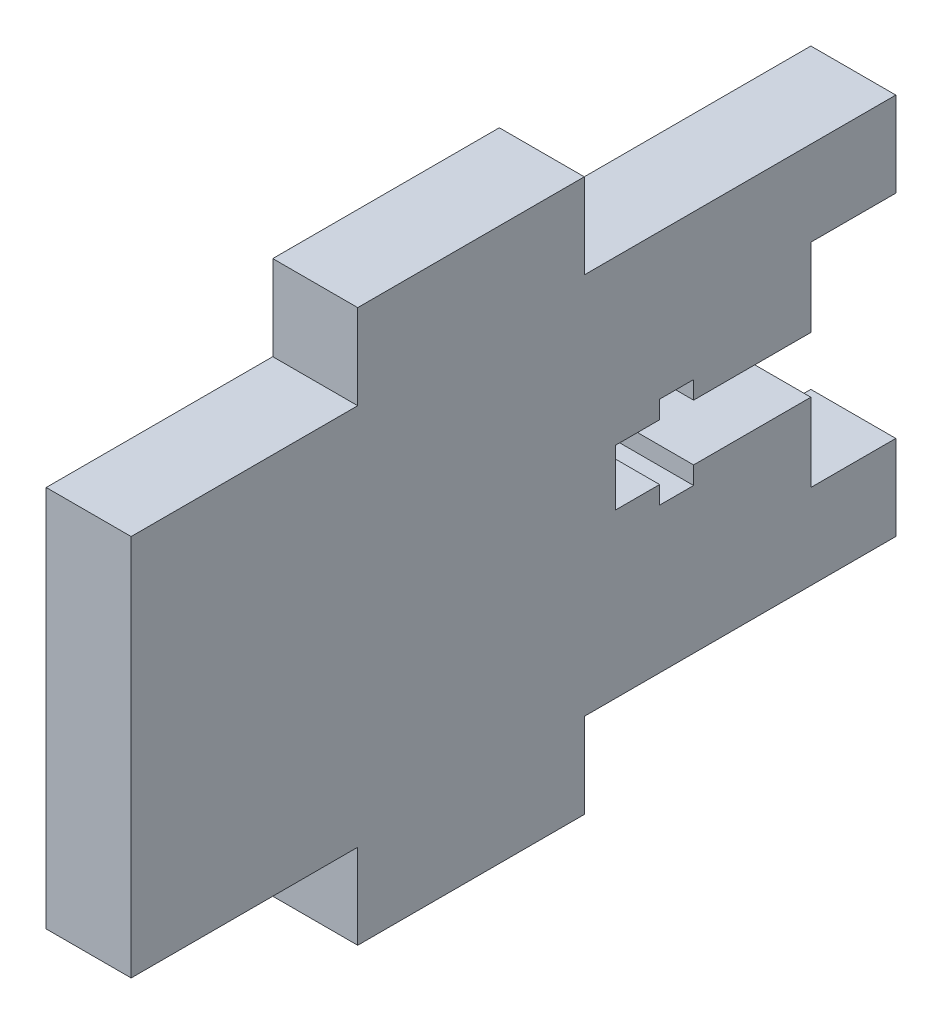
ISO-10303-21;
HEADER;
FILE_DESCRIPTION(('STEP AP214'),'2;1');
FILE_NAME('part.step','',(''),(''),'','','');
FILE_SCHEMA(('AUTOMOTIVE_DESIGN { 1 0 10303 214 1 1 1 1 }'));
ENDSEC;
DATA;
#1=APPLICATION_CONTEXT('core data for automotive mechanical design processes');
#2=APPLICATION_PROTOCOL_DEFINITION('international standard','automotive_design',2000,#1);
#3=PRODUCT_CONTEXT('',#1,'mechanical');
#4=PRODUCT('Part','Part','',(#3));
#5=PRODUCT_RELATED_PRODUCT_CATEGORY('part','',(#4));
#6=PRODUCT_DEFINITION_FORMATION('','',#4);
#7=PRODUCT_DEFINITION_CONTEXT('part definition',#1,'design');
#8=PRODUCT_DEFINITION('design','',#6,#7);
#9=PRODUCT_DEFINITION_SHAPE('','',#8);
#10=(LENGTH_UNIT() NAMED_UNIT(*) SI_UNIT(.MILLI.,.METRE.));
#11=(NAMED_UNIT(*) PLANE_ANGLE_UNIT() SI_UNIT($,.RADIAN.));
#12=(NAMED_UNIT(*) SI_UNIT($,.STERADIAN.) SOLID_ANGLE_UNIT());
#13=UNCERTAINTY_MEASURE_WITH_UNIT(LENGTH_MEASURE(1.E-05),#10,'distance_accuracy_value','');
#14=(GEOMETRIC_REPRESENTATION_CONTEXT(3) GLOBAL_UNCERTAINTY_ASSIGNED_CONTEXT((#13)) GLOBAL_UNIT_ASSIGNED_CONTEXT((#10,
#11,#12)) REPRESENTATION_CONTEXT('',''));
#15=CARTESIAN_POINT('',(0.,0.,0.));
#16=DIRECTION('',(0.,0.,1.));
#17=DIRECTION('',(1.,0.,0.));
#18=AXIS2_PLACEMENT_3D('',#15,#16,#17);
#19=CARTESIAN_POINT('',(0.,0.,0.));
#20=DIRECTION('',(0.,0.,-1.));
#21=DIRECTION('',(-1.,0.,0.));
#22=AXIS2_PLACEMENT_3D('',#19,#20,#21);
#23=PLANE('',#22);
#24=DIRECTION('',(-1.,0.,0.));
#25=VECTOR('',#24,1.);
#26=CARTESIAN_POINT('',(-22.22495,-2.09550000000003,0.));
#27=LINE('',#26,#25);
#28=CARTESIAN_POINT('',(-22.225,-2.09550000000003,0.));
#29=VERTEX_POINT('',#28);
#30=CARTESIAN_POINT('',(-28.575,-2.09550000000003,0.));
#31=VERTEX_POINT('',#30);
#32=EDGE_CURVE('E272',#29,#31,#27,.T.);
#33=ORIENTED_EDGE('',*,*,#32,.F.);
#34=DIRECTION('',(0.,1.,0.));
#35=VECTOR('',#34,1.);
#36=CARTESIAN_POINT('',(-22.225,14.2875,0.));
#37=LINE('',#36,#35);
#38=CARTESIAN_POINT('',(-22.225,-7.9375,0.));
#39=VERTEX_POINT('',#38);
#40=EDGE_CURVE('E372',#39,#29,#37,.T.);
#41=ORIENTED_EDGE('',*,*,#40,.F.);
#42=DIRECTION('',(1.,0.,0.));
#43=VECTOR('',#42,1.);
#44=CARTESIAN_POINT('',(-28.575,-7.9375,0.));
#45=LINE('',#44,#43);
#46=CARTESIAN_POINT('',(-28.575,-7.9375,0.));
#47=VERTEX_POINT('',#46);
#48=EDGE_CURVE('E322',#47,#39,#45,.T.);
#49=ORIENTED_EDGE('',*,*,#48,.F.);
#50=DIRECTION('',(0.,-1.,0.));
#51=VECTOR('',#50,1.);
#52=CARTESIAN_POINT('',(-28.575,14.2875,0.));
#53=LINE('',#52,#51);
#54=EDGE_CURVE('E375',#31,#47,#53,.T.);
#55=ORIENTED_EDGE('',*,*,#54,.F.);
#56=EDGE_LOOP('',(#33,#41,#49,#55));
#57=FACE_BOUND('',#56,.T.);
#58=ADVANCED_FACE('F35',(#57),#23,.T.);
#59=DIRECTION('',(-1.,0.,0.));
#60=VECTOR('',#59,1.);
#61=CARTESIAN_POINT('',(-22.22495,2.09549999999998,0.));
#62=LINE('',#61,#60);
#63=CARTESIAN_POINT('',(-22.225,2.09549999999998,0.));
#64=VERTEX_POINT('',#63);
#65=CARTESIAN_POINT('',(-28.575,2.09549999999997,0.));
#66=VERTEX_POINT('',#65);
#67=EDGE_CURVE('E275',#64,#66,#62,.T.);
#68=ORIENTED_EDGE('',*,*,#67,.T.);
#69=CARTESIAN_POINT('',(-28.575,7.9375,0.));
#70=VERTEX_POINT('',#69);
#71=EDGE_CURVE('E361',#70,#66,#53,.T.);
#72=ORIENTED_EDGE('',*,*,#71,.F.);
#73=DIRECTION('',(-1.,0.,0.));
#74=VECTOR('',#73,1.);
#75=CARTESIAN_POINT('',(-28.575,7.9375,0.));
#76=LINE('',#75,#74);
#77=CARTESIAN_POINT('',(-22.225,7.9375,0.));
#78=VERTEX_POINT('',#77);
#79=EDGE_CURVE('E341',#78,#70,#76,.T.);
#80=ORIENTED_EDGE('',*,*,#79,.F.);
#81=EDGE_CURVE('E39',#64,#78,#37,.T.);
#82=ORIENTED_EDGE('',*,*,#81,.F.);
#83=EDGE_LOOP('',(#68,#72,#80,#82));
#84=FACE_BOUND('',#83,.T.);
#85=ADVANCED_FACE('F525',(#84),#23,.T.);
#86=CARTESIAN_POINT('',(-22.225,14.2875,80.0720536519049));
#87=DIRECTION('',(0.,-1.,0.));
#88=DIRECTION('',(0.,0.,-1.));
#89=AXIS2_PLACEMENT_3D('',#86,#87,#88);
#90=PLANE('',#89);
#91=DIRECTION('',(1.,0.,0.));
#92=VECTOR('',#91,1.);
#93=CARTESIAN_POINT('',(-22.225,14.2875,33.8666666666667));
#94=LINE('',#93,#92);
#95=CARTESIAN_POINT('',(-28.575,14.2875,33.8666666666667));
#96=VERTEX_POINT('',#95);
#97=CARTESIAN_POINT('',(-22.225,14.2875,33.8666666666667));
#98=VERTEX_POINT('',#97);
#99=EDGE_CURVE('E437',#96,#98,#94,.T.);
#100=ORIENTED_EDGE('',*,*,#99,.F.);
#101=DIRECTION('',(0.,0.,-1.));
#102=VECTOR('',#101,1.);
#103=CARTESIAN_POINT('',(-28.575,14.2875,80.0720536519049));
#104=LINE('',#103,#102);
#105=CARTESIAN_POINT('',(-28.575,14.2875,50.8));
#106=VERTEX_POINT('',#105);
#107=EDGE_CURVE('E398',#106,#96,#104,.T.);
#108=ORIENTED_EDGE('',*,*,#107,.F.);
#109=DIRECTION('',(-1.,0.,0.));
#110=VECTOR('',#109,1.);
#111=CARTESIAN_POINT('',(-22.225,14.2875,50.8));
#112=LINE('',#111,#110);
#113=CARTESIAN_POINT('',(-22.225,14.2875,50.8));
#114=VERTEX_POINT('',#113);
#115=EDGE_CURVE('E384',#114,#106,#112,.T.);
#116=ORIENTED_EDGE('',*,*,#115,.F.);
#117=DIRECTION('',(0.,0.,-1.));
#118=VECTOR('',#117,1.);
#119=CARTESIAN_POINT('',(-22.225,14.2875,80.0720536519049));
#120=LINE('',#119,#118);
#121=EDGE_CURVE('E394',#114,#98,#120,.T.);
#122=ORIENTED_EDGE('',*,*,#121,.T.);
#123=EDGE_LOOP('',(#100,#108,#116,#122));
#124=FACE_BOUND('',#123,.T.);
#125=ADVANCED_FACE('F454',(#124),#90,.F.);
#126=DIRECTION('',(-1.,0.,0.));
#127=VECTOR('',#126,1.);
#128=CARTESIAN_POINT('',(-22.225,14.2875,16.9333333333333));
#129=LINE('',#128,#127);
#130=CARTESIAN_POINT('',(-22.225,14.2875,16.9333333333333));
#131=VERTEX_POINT('',#130);
#132=CARTESIAN_POINT('',(-28.575,14.2875,16.9333333333333));
#133=VERTEX_POINT('',#132);
#134=EDGE_CURVE('E435',#131,#133,#129,.T.);
#135=ORIENTED_EDGE('',*,*,#134,.F.);
#136=CARTESIAN_POINT('',(-22.225,14.2875,-6.35));
#137=VERTEX_POINT('',#136);
#138=EDGE_CURVE('E374',#131,#137,#120,.T.);
#139=ORIENTED_EDGE('',*,*,#138,.T.);
#140=DIRECTION('',(1.,0.,0.));
#141=VECTOR('',#140,1.);
#142=CARTESIAN_POINT('',(-28.575,14.2875,-6.35));
#143=LINE('',#142,#141);
#144=CARTESIAN_POINT('',(-28.575,14.2875,-6.35));
#145=VERTEX_POINT('',#144);
#146=EDGE_CURVE('E345',#145,#137,#143,.T.);
#147=ORIENTED_EDGE('',*,*,#146,.F.);
#148=EDGE_CURVE('E397',#133,#145,#104,.T.);
#149=ORIENTED_EDGE('',*,*,#148,.F.);
#150=EDGE_LOOP('',(#135,#139,#147,#149));
#151=FACE_BOUND('',#150,.T.);
#152=ADVANCED_FACE('F488',(#151),#90,.F.);
#153=CARTESIAN_POINT('',(-22.225,-14.2875,80.0720536519049));
#154=DIRECTION('',(0.,1.,0.));
#155=DIRECTION('',(-1.,0.,0.));
#156=AXIS2_PLACEMENT_3D('',#153,#154,#155);
#157=PLANE('',#156);
#158=DIRECTION('',(-1.,0.,0.));
#159=VECTOR('',#158,1.);
#160=CARTESIAN_POINT('',(-22.225,-14.2875,33.8666666666667));
#161=LINE('',#160,#159);
#162=CARTESIAN_POINT('',(-22.225,-14.2875,33.8666666666667));
#163=VERTEX_POINT('',#162);
#164=CARTESIAN_POINT('',(-28.575,-14.2875,33.8666666666667));
#165=VERTEX_POINT('',#164);
#166=EDGE_CURVE('E12',#163,#165,#161,.T.);
#167=ORIENTED_EDGE('',*,*,#166,.F.);
#168=DIRECTION('',(0.,0.,-1.));
#169=VECTOR('',#168,1.);
#170=CARTESIAN_POINT('',(-22.225,-14.2875,80.0720536519049));
#171=LINE('',#170,#169);
#172=CARTESIAN_POINT('',(-22.225,-14.2875,50.8));
#173=VERTEX_POINT('',#172);
#174=EDGE_CURVE('E403',#173,#163,#171,.T.);
#175=ORIENTED_EDGE('',*,*,#174,.F.);
#176=DIRECTION('',(1.,0.,0.));
#177=VECTOR('',#176,1.);
#178=CARTESIAN_POINT('',(-22.225,-14.2875,50.8));
#179=LINE('',#178,#177);
#180=CARTESIAN_POINT('',(-28.575,-14.2875,50.8));
#181=VERTEX_POINT('',#180);
#182=EDGE_CURVE('E390',#181,#173,#179,.T.);
#183=ORIENTED_EDGE('',*,*,#182,.F.);
#184=DIRECTION('',(0.,0.,-1.));
#185=VECTOR('',#184,1.);
#186=CARTESIAN_POINT('',(-28.575,-14.2875,80.0720536519049));
#187=LINE('',#186,#185);
#188=EDGE_CURVE('E393',#181,#165,#187,.T.);
#189=ORIENTED_EDGE('',*,*,#188,.T.);
#190=EDGE_LOOP('',(#167,#175,#183,#189));
#191=FACE_BOUND('',#190,.T.);
#192=ADVANCED_FACE('F516',(#191),#157,.F.);
#193=DIRECTION('',(1.,0.,0.));
#194=VECTOR('',#193,1.);
#195=CARTESIAN_POINT('',(-22.225,-14.2875,16.9333333333333));
#196=LINE('',#195,#194);
#197=CARTESIAN_POINT('',(-28.575,-14.2875,16.9333333333333));
#198=VERTEX_POINT('',#197);
#199=CARTESIAN_POINT('',(-22.225,-14.2875,16.9333333333333));
#200=VERTEX_POINT('',#199);
#201=EDGE_CURVE('E45',#198,#200,#196,.T.);
#202=ORIENTED_EDGE('',*,*,#201,.F.);
#203=CARTESIAN_POINT('',(-28.575,-14.2875,-6.35));
#204=VERTEX_POINT('',#203);
#205=EDGE_CURVE('E402',#198,#204,#187,.T.);
#206=ORIENTED_EDGE('',*,*,#205,.T.);
#207=DIRECTION('',(-1.,0.,0.));
#208=VECTOR('',#207,1.);
#209=CARTESIAN_POINT('',(-28.575,-14.2875,-6.35));
#210=LINE('',#209,#208);
#211=CARTESIAN_POINT('',(-22.225,-14.2875,-6.35));
#212=VERTEX_POINT('',#211);
#213=EDGE_CURVE('E331',#212,#204,#210,.T.);
#214=ORIENTED_EDGE('',*,*,#213,.F.);
#215=EDGE_CURVE('E406',#200,#212,#171,.T.);
#216=ORIENTED_EDGE('',*,*,#215,.F.);
#217=EDGE_LOOP('',(#202,#206,#214,#216));
#218=FACE_BOUND('',#217,.T.);
#219=ADVANCED_FACE('F514',(#218),#157,.F.);
#220=CARTESIAN_POINT('',(-22.225,14.2875,80.0720536519049));
#221=DIRECTION('',(-1.,0.,0.));
#222=DIRECTION('',(0.,-1.,0.));
#223=AXIS2_PLACEMENT_3D('',#220,#221,#222);
#224=PLANE('',#223);
#225=ORIENTED_EDGE('',*,*,#40,.T.);
#226=DIRECTION('',(0.,0.,1.));
#227=VECTOR('',#226,1.);
#228=CARTESIAN_POINT('',(-22.225,-2.09549999999973,80.072053651905));
#229=LINE('',#228,#227);
#230=CARTESIAN_POINT('',(-22.225,-2.09549999999999,8.76299999999999));
#231=VERTEX_POINT('',#230);
#232=EDGE_CURVE('E319',#29,#231,#229,.T.);
#233=ORIENTED_EDGE('',*,*,#232,.T.);
#234=DIRECTION('',(0.,-1.,0.));
#235=VECTOR('',#234,1.);
#236=CARTESIAN_POINT('',(-22.225,14.2874999999985,8.76299999999965));
#237=LINE('',#236,#235);
#238=CARTESIAN_POINT('',(-22.225,-3.42899999999999,8.76300000000002));
#239=VERTEX_POINT('',#238);
#240=EDGE_CURVE('E274',#231,#239,#237,.T.);
#241=ORIENTED_EDGE('',*,*,#240,.T.);
#242=DIRECTION('',(0.,0.,1.));
#243=VECTOR('',#242,1.);
#244=CARTESIAN_POINT('',(-22.225,-3.42899999999975,80.072053651905));
#245=LINE('',#244,#243);
#246=CARTESIAN_POINT('',(-22.225,-3.42899999999999,11.303));
#247=VERTEX_POINT('',#246);
#248=EDGE_CURVE('E233',#239,#247,#245,.T.);
#249=ORIENTED_EDGE('',*,*,#248,.T.);
#250=DIRECTION('',(0.,1.,0.));
#251=VECTOR('',#250,1.);
#252=CARTESIAN_POINT('',(-22.225,14.2874999999986,11.3029999999996));
#253=LINE('',#252,#251);
#254=CARTESIAN_POINT('',(-22.225,-2.09549999999998,11.303));
#255=VERTEX_POINT('',#254);
#256=EDGE_CURVE('E296',#247,#255,#253,.T.);
#257=ORIENTED_EDGE('',*,*,#256,.T.);
#258=DIRECTION('',(0.,0.,1.));
#259=VECTOR('',#258,1.);
#260=CARTESIAN_POINT('',(-22.225,-2.09549999999974,80.072053651905));
#261=LINE('',#260,#259);
#262=CARTESIAN_POINT('',(-22.225,-2.09549999999997,14.605));
#263=VERTEX_POINT('',#262);
#264=EDGE_CURVE('E299',#255,#263,#261,.T.);
#265=ORIENTED_EDGE('',*,*,#264,.T.);
#266=DIRECTION('',(0.,1.,0.));
#267=VECTOR('',#266,1.);
#268=CARTESIAN_POINT('',(-22.225,14.2875,14.605));
#269=LINE('',#268,#267);
#270=CARTESIAN_POINT('',(-22.225,2.09550000000003,14.605));
#271=VERTEX_POINT('',#270);
#272=EDGE_CURVE('E302',#263,#271,#269,.T.);
#273=ORIENTED_EDGE('',*,*,#272,.T.);
#274=DIRECTION('',(0.,0.,-1.));
#275=VECTOR('',#274,1.);
#276=CARTESIAN_POINT('',(-22.225,2.09550000000027,80.072053651905));
#277=LINE('',#276,#275);
#278=CARTESIAN_POINT('',(-22.225,2.09550000000002,11.303));
#279=VERTEX_POINT('',#278);
#280=EDGE_CURVE('E305',#271,#279,#277,.T.);
#281=ORIENTED_EDGE('',*,*,#280,.T.);
#282=DIRECTION('',(0.,1.,0.));
#283=VECTOR('',#282,1.);
#284=CARTESIAN_POINT('',(-22.225,14.2875,11.303));
#285=LINE('',#284,#283);
#286=CARTESIAN_POINT('',(-22.225,3.42900000000002,11.303));
#287=VERTEX_POINT('',#286);
#288=EDGE_CURVE('E308',#279,#287,#285,.T.);
#289=ORIENTED_EDGE('',*,*,#288,.T.);
#290=DIRECTION('',(0.,0.,-1.));
#291=VECTOR('',#290,1.);
#292=CARTESIAN_POINT('',(-22.225,3.42900000000026,80.072053651905));
#293=LINE('',#292,#291);
#294=CARTESIAN_POINT('',(-22.225,3.42900000000001,8.76299999999999));
#295=VERTEX_POINT('',#294);
#296=EDGE_CURVE('E311',#287,#295,#293,.T.);
#297=ORIENTED_EDGE('',*,*,#296,.T.);
#298=DIRECTION('',(0.,-1.,0.));
#299=VECTOR('',#298,1.);
#300=CARTESIAN_POINT('',(-22.225,14.2875,8.76299999999999));
#301=LINE('',#300,#299);
#302=CARTESIAN_POINT('',(-22.225,2.09550000000001,8.76299999999999));
#303=VERTEX_POINT('',#302);
#304=EDGE_CURVE('E314',#295,#303,#301,.T.);
#305=ORIENTED_EDGE('',*,*,#304,.T.);
#306=DIRECTION('',(0.,0.,-1.));
#307=VECTOR('',#306,1.);
#308=CARTESIAN_POINT('',(-22.225,2.09550000000026,80.072053651905));
#309=LINE('',#308,#307);
#310=EDGE_CURVE('E317',#303,#64,#309,.T.);
#311=ORIENTED_EDGE('',*,*,#310,.T.);
#312=ORIENTED_EDGE('',*,*,#81,.T.);
#313=DIRECTION('',(0.,0.,1.));
#314=VECTOR('',#313,1.);
#315=CARTESIAN_POINT('',(-22.225,7.9375,-6.35));
#316=LINE('',#315,#314);
#317=CARTESIAN_POINT('',(-22.225,7.9375,-6.35));
#318=VERTEX_POINT('',#317);
#319=EDGE_CURVE('E365',#318,#78,#316,.T.);
#320=ORIENTED_EDGE('',*,*,#319,.F.);
#321=DIRECTION('',(0.,-1.,0.));
#322=VECTOR('',#321,1.);
#323=CARTESIAN_POINT('',(-22.225,14.2875,-6.35));
#324=LINE('',#323,#322);
#325=EDGE_CURVE('E348',#137,#318,#324,.T.);
#326=ORIENTED_EDGE('',*,*,#325,.F.);
#327=ORIENTED_EDGE('',*,*,#138,.F.);
#328=DIRECTION('',(0.,1.,0.));
#329=VECTOR('',#328,1.);
#330=CARTESIAN_POINT('',(-22.225,-38.7223079275888,16.9333333333333));
#331=LINE('',#330,#329);
#332=CARTESIAN_POINT('',(-22.225,20.6375,16.9333333333333));
#333=VERTEX_POINT('',#332);
#334=EDGE_CURVE('E425',#131,#333,#331,.T.);
#335=ORIENTED_EDGE('',*,*,#334,.T.);
#336=DIRECTION('',(0.,0.,-1.));
#337=VECTOR('',#336,1.);
#338=CARTESIAN_POINT('',(-22.225,20.6375,33.8666666666667));
#339=LINE('',#338,#337);
#340=CARTESIAN_POINT('',(-22.225,20.6375,33.8666666666667));
#341=VERTEX_POINT('',#340);
#342=EDGE_CURVE('E355',#341,#333,#339,.T.);
#343=ORIENTED_EDGE('',*,*,#342,.F.);
#344=DIRECTION('',(0.,1.,0.));
#345=VECTOR('',#344,1.);
#346=CARTESIAN_POINT('',(-22.225,-38.7223079275888,33.8666666666667));
#347=LINE('',#346,#345);
#348=EDGE_CURVE('E444',#98,#341,#347,.T.);
#349=ORIENTED_EDGE('',*,*,#348,.F.);
#350=ORIENTED_EDGE('',*,*,#121,.F.);
#351=DIRECTION('',(0.,1.,0.));
#352=VECTOR('',#351,1.);
#353=CARTESIAN_POINT('',(-22.225,14.2875,50.8));
#354=LINE('',#353,#352);
#355=EDGE_CURVE('E387',#173,#114,#354,.T.);
#356=ORIENTED_EDGE('',*,*,#355,.F.);
#357=ORIENTED_EDGE('',*,*,#174,.T.);
#358=CARTESIAN_POINT('',(-22.225,-20.6375,33.8666666666667));
#359=VERTEX_POINT('',#358);
#360=EDGE_CURVE('E428',#359,#163,#347,.T.);
#361=ORIENTED_EDGE('',*,*,#360,.F.);
#362=DIRECTION('',(0.,0.,-1.));
#363=VECTOR('',#362,1.);
#364=CARTESIAN_POINT('',(-22.225,-20.6375,33.8666666666667));
#365=LINE('',#364,#363);
#366=CARTESIAN_POINT('',(-22.225,-20.6375,16.9333333333333));
#367=VERTEX_POINT('',#366);
#368=EDGE_CURVE('E423',#359,#367,#365,.T.);
#369=ORIENTED_EDGE('',*,*,#368,.T.);
#370=EDGE_CURVE('E415',#367,#200,#331,.T.);
#371=ORIENTED_EDGE('',*,*,#370,.T.);
#372=ORIENTED_EDGE('',*,*,#215,.T.);
#373=DIRECTION('',(0.,-1.,0.));
#374=VECTOR('',#373,1.);
#375=CARTESIAN_POINT('',(-22.225,-14.2875,-6.35));
#376=LINE('',#375,#374);
#377=CARTESIAN_POINT('',(-22.225,-7.9375,-6.35));
#378=VERTEX_POINT('',#377);
#379=EDGE_CURVE('E328',#378,#212,#376,.T.);
#380=ORIENTED_EDGE('',*,*,#379,.F.);
#381=DIRECTION('',(0.,0.,1.));
#382=VECTOR('',#381,1.);
#383=CARTESIAN_POINT('',(-22.225,-7.9375,-6.35));
#384=LINE('',#383,#382);
#385=EDGE_CURVE('E334',#378,#39,#384,.T.);
#386=ORIENTED_EDGE('',*,*,#385,.T.);
#387=EDGE_LOOP('',(#225,#233,#241,#249,#257,#265,#273,#281,#289,#297,#305,#311,#312,#320,#326,
#327,#335,#343,#349,#350,#356,#357,#361,#369,#371,#372,#380,#386));
#388=FACE_BOUND('',#387,.T.);
#389=ADVANCED_FACE('F420',(#388),#224,.F.);
#390=CARTESIAN_POINT('',(-28.575,14.2875,80.0720536519049));
#391=DIRECTION('',(1.,0.,0.));
#392=DIRECTION('',(0.,1.,0.));
#393=AXIS2_PLACEMENT_3D('',#390,#391,#392);
#394=PLANE('',#393);
#395=DIRECTION('',(0.,-1.,0.));
#396=VECTOR('',#395,1.);
#397=CARTESIAN_POINT('',(-28.575,-3.429,8.76300000000002));
#398=LINE('',#397,#396);
#399=CARTESIAN_POINT('',(-28.575,-2.0955,8.76299999999999));
#400=VERTEX_POINT('',#399);
#401=CARTESIAN_POINT('',(-28.575,-3.429,8.76300000000002));
#402=VERTEX_POINT('',#401);
#403=EDGE_CURVE('E240',#400,#402,#398,.T.);
#404=ORIENTED_EDGE('',*,*,#403,.F.);
#405=DIRECTION('',(0.,0.,1.));
#406=VECTOR('',#405,1.);
#407=CARTESIAN_POINT('',(-28.575,-2.0955,8.76299999999999));
#408=LINE('',#407,#406);
#409=EDGE_CURVE('E53',#31,#400,#408,.T.);
#410=ORIENTED_EDGE('',*,*,#409,.F.);
#411=ORIENTED_EDGE('',*,*,#54,.T.);
#412=DIRECTION('',(0.,0.,1.));
#413=VECTOR('',#412,1.);
#414=CARTESIAN_POINT('',(-28.575,-7.9375,-6.35));
#415=LINE('',#414,#413);
#416=CARTESIAN_POINT('',(-28.575,-7.9375,-6.35));
#417=VERTEX_POINT('',#416);
#418=EDGE_CURVE('E338',#417,#47,#415,.T.);
#419=ORIENTED_EDGE('',*,*,#418,.F.);
#420=DIRECTION('',(0.,1.,0.));
#421=VECTOR('',#420,1.);
#422=CARTESIAN_POINT('',(-28.575,-14.2875,-6.35));
#423=LINE('',#422,#421);
#424=EDGE_CURVE('E323',#204,#417,#423,.T.);
#425=ORIENTED_EDGE('',*,*,#424,.F.);
#426=ORIENTED_EDGE('',*,*,#205,.F.);
#427=DIRECTION('',(0.,1.,0.));
#428=VECTOR('',#427,1.);
#429=CARTESIAN_POINT('',(-28.575,-38.7223079275888,16.9333333333333));
#430=LINE('',#429,#428);
#431=CARTESIAN_POINT('',(-28.575,-20.6375,16.9333333333333));
#432=VERTEX_POINT('',#431);
#433=EDGE_CURVE('E418',#432,#198,#430,.T.);
#434=ORIENTED_EDGE('',*,*,#433,.F.);
#435=DIRECTION('',(0.,0.,1.));
#436=VECTOR('',#435,1.);
#437=CARTESIAN_POINT('',(-28.575,-20.6375,33.8666666666667));
#438=LINE('',#437,#436);
#439=CARTESIAN_POINT('',(-28.575,-20.6375,33.8666666666667));
#440=VERTEX_POINT('',#439);
#441=EDGE_CURVE('E438',#432,#440,#438,.T.);
#442=ORIENTED_EDGE('',*,*,#441,.T.);
#443=DIRECTION('',(0.,1.,0.));
#444=VECTOR('',#443,1.);
#445=CARTESIAN_POINT('',(-28.575,-38.7223079275888,33.8666666666667));
#446=LINE('',#445,#444);
#447=EDGE_CURVE('E453',#440,#165,#446,.T.);
#448=ORIENTED_EDGE('',*,*,#447,.T.);
#449=ORIENTED_EDGE('',*,*,#188,.F.);
#450=DIRECTION('',(0.,-1.,0.));
#451=VECTOR('',#450,1.);
#452=CARTESIAN_POINT('',(-28.575,14.2875,50.8));
#453=LINE('',#452,#451);
#454=EDGE_CURVE('E380',#106,#181,#453,.T.);
#455=ORIENTED_EDGE('',*,*,#454,.F.);
#456=ORIENTED_EDGE('',*,*,#107,.T.);
#457=CARTESIAN_POINT('',(-28.575,20.6375,33.8666666666667));
#458=VERTEX_POINT('',#457);
#459=EDGE_CURVE('E446',#96,#458,#446,.T.);
#460=ORIENTED_EDGE('',*,*,#459,.T.);
#461=DIRECTION('',(0.,0.,1.));
#462=VECTOR('',#461,1.);
#463=CARTESIAN_POINT('',(-28.575,20.6375,33.8666666666667));
#464=LINE('',#463,#462);
#465=CARTESIAN_POINT('',(-28.575,20.6375,16.9333333333333));
#466=VERTEX_POINT('',#465);
#467=EDGE_CURVE('E474',#466,#458,#464,.T.);
#468=ORIENTED_EDGE('',*,*,#467,.F.);
#469=EDGE_CURVE('E424',#133,#466,#430,.T.);
#470=ORIENTED_EDGE('',*,*,#469,.F.);
#471=ORIENTED_EDGE('',*,*,#148,.T.);
#472=DIRECTION('',(0.,1.,0.));
#473=VECTOR('',#472,1.);
#474=CARTESIAN_POINT('',(-28.575,14.2875,-6.35));
#475=LINE('',#474,#473);
#476=CARTESIAN_POINT('',(-28.575,7.9375,-6.35));
#477=VERTEX_POINT('',#476);
#478=EDGE_CURVE('E342',#477,#145,#475,.T.);
#479=ORIENTED_EDGE('',*,*,#478,.F.);
#480=DIRECTION('',(0.,0.,1.));
#481=VECTOR('',#480,1.);
#482=CARTESIAN_POINT('',(-28.575,7.9375,-6.35));
#483=LINE('',#482,#481);
#484=EDGE_CURVE('E352',#477,#70,#483,.T.);
#485=ORIENTED_EDGE('',*,*,#484,.T.);
#486=ORIENTED_EDGE('',*,*,#71,.T.);
#487=DIRECTION('',(0.,0.,-1.));
#488=VECTOR('',#487,1.);
#489=CARTESIAN_POINT('',(-28.575,2.0955,8.76299999999999));
#490=LINE('',#489,#488);
#491=CARTESIAN_POINT('',(-28.575,2.0955,8.76299999999999));
#492=VERTEX_POINT('',#491);
#493=EDGE_CURVE('E270',#492,#66,#490,.T.);
#494=ORIENTED_EDGE('',*,*,#493,.F.);
#495=DIRECTION('',(0.,-1.,0.));
#496=VECTOR('',#495,1.);
#497=CARTESIAN_POINT('',(-28.575,3.429,8.76299999999999));
#498=LINE('',#497,#496);
#499=CARTESIAN_POINT('',(-28.575,3.429,8.76299999999999));
#500=VERTEX_POINT('',#499);
#501=EDGE_CURVE('E267',#500,#492,#498,.T.);
#502=ORIENTED_EDGE('',*,*,#501,.F.);
#503=DIRECTION('',(0.,0.,-1.));
#504=VECTOR('',#503,1.);
#505=CARTESIAN_POINT('',(-28.575,3.42900000000001,11.303));
#506=LINE('',#505,#504);
#507=CARTESIAN_POINT('',(-28.575,3.42900000000001,11.303));
#508=VERTEX_POINT('',#507);
#509=EDGE_CURVE('E264',#508,#500,#506,.T.);
#510=ORIENTED_EDGE('',*,*,#509,.F.);
#511=DIRECTION('',(0.,1.,0.));
#512=VECTOR('',#511,1.);
#513=CARTESIAN_POINT('',(-28.575,2.09550000000001,11.303));
#514=LINE('',#513,#512);
#515=CARTESIAN_POINT('',(-28.575,2.09550000000001,11.303));
#516=VERTEX_POINT('',#515);
#517=EDGE_CURVE('E261',#516,#508,#514,.T.);
#518=ORIENTED_EDGE('',*,*,#517,.F.);
#519=DIRECTION('',(0.,0.,-1.));
#520=VECTOR('',#519,1.);
#521=CARTESIAN_POINT('',(-28.575,2.09550000000001,11.303));
#522=LINE('',#521,#520);
#523=CARTESIAN_POINT('',(-28.575,2.09550000000003,14.605));
#524=VERTEX_POINT('',#523);
#525=EDGE_CURVE('E258',#524,#516,#522,.T.);
#526=ORIENTED_EDGE('',*,*,#525,.F.);
#527=DIRECTION('',(0.,1.,0.));
#528=VECTOR('',#527,1.);
#529=CARTESIAN_POINT('',(-28.575,-2.09549999999998,14.605));
#530=LINE('',#529,#528);
#531=CARTESIAN_POINT('',(-28.575,-2.09549999999998,14.605));
#532=VERTEX_POINT('',#531);
#533=EDGE_CURVE('E255',#532,#524,#530,.T.);
#534=ORIENTED_EDGE('',*,*,#533,.F.);
#535=DIRECTION('',(0.,0.,1.));
#536=VECTOR('',#535,1.);
#537=CARTESIAN_POINT('',(-28.575,-2.09549999999999,11.303));
#538=LINE('',#537,#536);
#539=CARTESIAN_POINT('',(-28.575,-2.09549999999999,11.303));
#540=VERTEX_POINT('',#539);
#541=EDGE_CURVE('E249',#540,#532,#538,.T.);
#542=ORIENTED_EDGE('',*,*,#541,.F.);
#543=DIRECTION('',(0.,1.,0.));
#544=VECTOR('',#543,1.);
#545=CARTESIAN_POINT('',(-28.575,-2.09549999999999,11.303));
#546=LINE('',#545,#544);
#547=CARTESIAN_POINT('',(-28.575,-3.42899999999999,11.303));
#548=VERTEX_POINT('',#547);
#549=EDGE_CURVE('E247',#548,#540,#546,.T.);
#550=ORIENTED_EDGE('',*,*,#549,.F.);
#551=DIRECTION('',(0.,0.,1.));
#552=VECTOR('',#551,1.);
#553=CARTESIAN_POINT('',(-28.575,-3.42899999999999,11.303));
#554=LINE('',#553,#552);
#555=EDGE_CURVE('E230',#402,#548,#554,.T.);
#556=ORIENTED_EDGE('',*,*,#555,.F.);
#557=EDGE_LOOP('',(#404,#410,#411,#419,#425,#426,#434,#442,#448,#449,#455,#456,#460,#468,#470,
#471,#479,#485,#486,#494,#502,#510,#518,#526,#534,#542,#550,#556));
#558=FACE_BOUND('',#557,.T.);
#559=ADVANCED_FACE('F244',(#558),#394,.F.);
#560=CARTESIAN_POINT('',(0.,0.,50.8));
#561=DIRECTION('',(0.,0.,1.));
#562=DIRECTION('',(1.,0.,0.));
#563=AXIS2_PLACEMENT_3D('',#560,#561,#562);
#564=PLANE('',#563);
#565=ORIENTED_EDGE('',*,*,#182,.T.);
#566=ORIENTED_EDGE('',*,*,#355,.T.);
#567=ORIENTED_EDGE('',*,*,#115,.T.);
#568=ORIENTED_EDGE('',*,*,#454,.T.);
#569=EDGE_LOOP('',(#565,#566,#567,#568));
#570=FACE_BOUND('',#569,.T.);
#571=ADVANCED_FACE('F37',(#570),#564,.T.);
#572=CARTESIAN_POINT('',(-22.225,-20.6375,50.8));
#573=DIRECTION('',(0.,1.,0.));
#574=DIRECTION('',(0.,0.,1.));
#575=AXIS2_PLACEMENT_3D('',#572,#573,#574);
#576=PLANE('',#575);
#577=DIRECTION('',(-1.,0.,0.));
#578=VECTOR('',#577,1.);
#579=CARTESIAN_POINT('',(-28.575,-20.6375,16.9333333333333));
#580=LINE('',#579,#578);
#581=EDGE_CURVE('E466',#367,#432,#580,.T.);
#582=ORIENTED_EDGE('',*,*,#581,.F.);
#583=ORIENTED_EDGE('',*,*,#368,.F.);
#584=DIRECTION('',(1.,0.,0.));
#585=VECTOR('',#584,1.);
#586=CARTESIAN_POINT('',(-28.575,-20.6375,33.8666666666667));
#587=LINE('',#586,#585);
#588=EDGE_CURVE('E432',#440,#359,#587,.T.);
#589=ORIENTED_EDGE('',*,*,#588,.F.);
#590=ORIENTED_EDGE('',*,*,#441,.F.);
#591=EDGE_LOOP('',(#582,#583,#589,#590));
#592=FACE_BOUND('',#591,.T.);
#593=ADVANCED_FACE('F465',(#592),#576,.F.);
#594=CARTESIAN_POINT('',(-28.575,-38.7223079275888,16.9333333333333));
#595=DIRECTION('',(0.,0.,1.));
#596=DIRECTION('',(1.,0.,0.));
#597=AXIS2_PLACEMENT_3D('',#594,#595,#596);
#598=PLANE('',#597);
#599=ORIENTED_EDGE('',*,*,#433,.T.);
#600=ORIENTED_EDGE('',*,*,#201,.T.);
#601=ORIENTED_EDGE('',*,*,#370,.F.);
#602=ORIENTED_EDGE('',*,*,#581,.T.);
#603=EDGE_LOOP('',(#599,#600,#601,#602));
#604=FACE_BOUND('',#603,.T.);
#605=ADVANCED_FACE('F413',(#604),#598,.F.);
#606=CARTESIAN_POINT('',(-28.575,-38.7223079275888,33.8666666666667));
#607=DIRECTION('',(0.,0.,-1.));
#608=DIRECTION('',(-1.,0.,0.));
#609=AXIS2_PLACEMENT_3D('',#606,#607,#608);
#610=PLANE('',#609);
#611=ORIENTED_EDGE('',*,*,#360,.T.);
#612=ORIENTED_EDGE('',*,*,#166,.T.);
#613=ORIENTED_EDGE('',*,*,#447,.F.);
#614=ORIENTED_EDGE('',*,*,#588,.T.);
#615=EDGE_LOOP('',(#611,#612,#613,#614));
#616=FACE_BOUND('',#615,.T.);
#617=ADVANCED_FACE('F460',(#616),#610,.F.);
#618=ORIENTED_EDGE('',*,*,#459,.F.);
#619=ORIENTED_EDGE('',*,*,#99,.T.);
#620=ORIENTED_EDGE('',*,*,#348,.T.);
#621=DIRECTION('',(1.,0.,0.));
#622=VECTOR('',#621,1.);
#623=CARTESIAN_POINT('',(-28.575,20.6375,33.8666666666667));
#624=LINE('',#623,#622);
#625=EDGE_CURVE('E478',#458,#341,#624,.T.);
#626=ORIENTED_EDGE('',*,*,#625,.F.);
#627=EDGE_LOOP('',(#618,#619,#620,#626));
#628=FACE_BOUND('',#627,.T.);
#629=ADVANCED_FACE('F442',(#628),#610,.F.);
#630=ORIENTED_EDGE('',*,*,#334,.F.);
#631=ORIENTED_EDGE('',*,*,#134,.T.);
#632=ORIENTED_EDGE('',*,*,#469,.T.);
#633=DIRECTION('',(-1.,0.,0.));
#634=VECTOR('',#633,1.);
#635=CARTESIAN_POINT('',(-28.575,20.6375,16.9333333333333));
#636=LINE('',#635,#634);
#637=EDGE_CURVE('E470',#333,#466,#636,.T.);
#638=ORIENTED_EDGE('',*,*,#637,.F.);
#639=EDGE_LOOP('',(#630,#631,#632,#638));
#640=FACE_BOUND('',#639,.T.);
#641=ADVANCED_FACE('F482',(#640),#598,.F.);
#642=CARTESIAN_POINT('',(-22.225,20.6375,80.0720536519049));
#643=DIRECTION('',(0.,-1.,0.));
#644=DIRECTION('',(0.,0.,-1.));
#645=AXIS2_PLACEMENT_3D('',#642,#643,#644);
#646=PLANE('',#645);
#647=ORIENTED_EDGE('',*,*,#467,.T.);
#648=ORIENTED_EDGE('',*,*,#625,.T.);
#649=ORIENTED_EDGE('',*,*,#342,.T.);
#650=ORIENTED_EDGE('',*,*,#637,.T.);
#651=EDGE_LOOP('',(#647,#648,#649,#650));
#652=FACE_BOUND('',#651,.T.);
#653=ADVANCED_FACE('F480',(#652),#646,.F.);
#654=CARTESIAN_POINT('',(-28.575,7.9375,-6.35));
#655=DIRECTION('',(0.,1.,0.));
#656=DIRECTION('',(0.,0.,1.));
#657=AXIS2_PLACEMENT_3D('',#654,#655,#656);
#658=PLANE('',#657);
#659=ORIENTED_EDGE('',*,*,#79,.T.);
#660=ORIENTED_EDGE('',*,*,#484,.F.);
#661=DIRECTION('',(-1.,0.,0.));
#662=VECTOR('',#661,1.);
#663=CARTESIAN_POINT('',(-28.575,7.9375,-6.35));
#664=LINE('',#663,#662);
#665=EDGE_CURVE('E350',#318,#477,#664,.T.);
#666=ORIENTED_EDGE('',*,*,#665,.F.);
#667=ORIENTED_EDGE('',*,*,#319,.T.);
#668=EDGE_LOOP('',(#659,#660,#666,#667));
#669=FACE_BOUND('',#668,.T.);
#670=ADVANCED_FACE('F496',(#669),#658,.F.);
#671=CARTESIAN_POINT('',(0.,0.,-6.35));
#672=DIRECTION('',(0.,0.,1.));
#673=DIRECTION('',(1.,0.,0.));
#674=AXIS2_PLACEMENT_3D('',#671,#672,#673);
#675=PLANE('',#674);
#676=ORIENTED_EDGE('',*,*,#478,.T.);
#677=ORIENTED_EDGE('',*,*,#146,.T.);
#678=ORIENTED_EDGE('',*,*,#325,.T.);
#679=ORIENTED_EDGE('',*,*,#665,.T.);
#680=EDGE_LOOP('',(#676,#677,#678,#679));
#681=FACE_BOUND('',#680,.T.);
#682=ADVANCED_FACE('F492',(#681),#675,.F.);
#683=CARTESIAN_POINT('',(-28.575,-7.9375,-6.35));
#684=DIRECTION('',(0.,-1.,0.));
#685=DIRECTION('',(0.,0.,-1.));
#686=AXIS2_PLACEMENT_3D('',#683,#684,#685);
#687=PLANE('',#686);
#688=ORIENTED_EDGE('',*,*,#48,.T.);
#689=ORIENTED_EDGE('',*,*,#385,.F.);
#690=DIRECTION('',(1.,0.,0.));
#691=VECTOR('',#690,1.);
#692=CARTESIAN_POINT('',(-28.575,-7.9375,-6.35));
#693=LINE('',#692,#691);
#694=EDGE_CURVE('E326',#417,#378,#693,.T.);
#695=ORIENTED_EDGE('',*,*,#694,.F.);
#696=ORIENTED_EDGE('',*,*,#418,.T.);
#697=EDGE_LOOP('',(#688,#689,#695,#696));
#698=FACE_BOUND('',#697,.T.);
#699=ADVANCED_FACE('F508',(#698),#687,.F.);
#700=CARTESIAN_POINT('',(0.,0.,-6.35));
#701=DIRECTION('',(0.,0.,-1.));
#702=DIRECTION('',(-1.,0.,0.));
#703=AXIS2_PLACEMENT_3D('',#700,#701,#702);
#704=PLANE('',#703);
#705=ORIENTED_EDGE('',*,*,#424,.T.);
#706=ORIENTED_EDGE('',*,*,#694,.T.);
#707=ORIENTED_EDGE('',*,*,#379,.T.);
#708=ORIENTED_EDGE('',*,*,#213,.T.);
#709=EDGE_LOOP('',(#705,#706,#707,#708));
#710=FACE_BOUND('',#709,.T.);
#711=ADVANCED_FACE('F513',(#710),#704,.T.);
#712=CARTESIAN_POINT('',(-22.22495,-2.09549999999999,8.76299999999999));
#713=DIRECTION('',(0.,-1.,0.));
#714=DIRECTION('',(0.,0.,-1.));
#715=AXIS2_PLACEMENT_3D('',#712,#713,#714);
#716=PLANE('',#715);
#717=ORIENTED_EDGE('',*,*,#32,.T.);
#718=ORIENTED_EDGE('',*,*,#409,.T.);
#719=DIRECTION('',(-1.,0.,0.));
#720=VECTOR('',#719,1.);
#721=CARTESIAN_POINT('',(-22.22495,-2.09549999999999,8.76299999999999));
#722=LINE('',#721,#720);
#723=EDGE_CURVE('E237',#231,#400,#722,.T.);
#724=ORIENTED_EDGE('',*,*,#723,.F.);
#725=ORIENTED_EDGE('',*,*,#232,.F.);
#726=EDGE_LOOP('',(#717,#718,#724,#725));
#727=FACE_BOUND('',#726,.T.);
#728=ADVANCED_FACE('F546',(#727),#716,.F.);
#729=CARTESIAN_POINT('',(-22.22495,2.09550000000001,8.76299999999999));
#730=DIRECTION('',(0.,1.,0.));
#731=DIRECTION('',(0.,0.,1.));
#732=AXIS2_PLACEMENT_3D('',#729,#730,#731);
#733=PLANE('',#732);
#734=DIRECTION('',(-1.,0.,0.));
#735=VECTOR('',#734,1.);
#736=CARTESIAN_POINT('',(-22.22495,2.09550000000001,8.76299999999999));
#737=LINE('',#736,#735);
#738=EDGE_CURVE('E278',#303,#492,#737,.T.);
#739=ORIENTED_EDGE('',*,*,#738,.T.);
#740=ORIENTED_EDGE('',*,*,#493,.T.);
#741=ORIENTED_EDGE('',*,*,#67,.F.);
#742=ORIENTED_EDGE('',*,*,#310,.F.);
#743=EDGE_LOOP('',(#739,#740,#741,#742));
#744=FACE_BOUND('',#743,.T.);
#745=ADVANCED_FACE('F549',(#744),#733,.F.);
#746=CARTESIAN_POINT('',(-22.22495,3.42900000000001,8.76299999999999));
#747=DIRECTION('',(0.,0.,-1.));
#748=DIRECTION('',(-1.,0.,0.));
#749=AXIS2_PLACEMENT_3D('',#746,#747,#748);
#750=PLANE('',#749);
#751=DIRECTION('',(-1.,0.,0.));
#752=VECTOR('',#751,1.);
#753=CARTESIAN_POINT('',(-22.22495,3.42900000000001,8.76299999999999));
#754=LINE('',#753,#752);
#755=EDGE_CURVE('E280',#295,#500,#754,.T.);
#756=ORIENTED_EDGE('',*,*,#755,.T.);
#757=ORIENTED_EDGE('',*,*,#501,.T.);
#758=ORIENTED_EDGE('',*,*,#738,.F.);
#759=ORIENTED_EDGE('',*,*,#304,.F.);
#760=EDGE_LOOP('',(#756,#757,#758,#759));
#761=FACE_BOUND('',#760,.T.);
#762=ADVANCED_FACE('F577',(#761),#750,.F.);
#763=CARTESIAN_POINT('',(-22.22495,3.42900000000002,11.303));
#764=DIRECTION('',(0.,1.,0.));
#765=DIRECTION('',(0.,0.,1.));
#766=AXIS2_PLACEMENT_3D('',#763,#764,#765);
#767=PLANE('',#766);
#768=DIRECTION('',(-1.,0.,0.));
#769=VECTOR('',#768,1.);
#770=CARTESIAN_POINT('',(-22.22495,3.42900000000002,11.303));
#771=LINE('',#770,#769);
#772=EDGE_CURVE('E282',#287,#508,#771,.T.);
#773=ORIENTED_EDGE('',*,*,#772,.T.);
#774=ORIENTED_EDGE('',*,*,#509,.T.);
#775=ORIENTED_EDGE('',*,*,#755,.F.);
#776=ORIENTED_EDGE('',*,*,#296,.F.);
#777=EDGE_LOOP('',(#773,#774,#775,#776));
#778=FACE_BOUND('',#777,.T.);
#779=ADVANCED_FACE('F573',(#778),#767,.F.);
#780=CARTESIAN_POINT('',(-22.22495,2.09550000000002,11.303));
#781=DIRECTION('',(0.,0.,1.));
#782=DIRECTION('',(1.,0.,0.));
#783=AXIS2_PLACEMENT_3D('',#780,#781,#782);
#784=PLANE('',#783);
#785=DIRECTION('',(-1.,0.,0.));
#786=VECTOR('',#785,1.);
#787=CARTESIAN_POINT('',(-22.22495,2.09550000000002,11.303));
#788=LINE('',#787,#786);
#789=EDGE_CURVE('E284',#279,#516,#788,.T.);
#790=ORIENTED_EDGE('',*,*,#789,.T.);
#791=ORIENTED_EDGE('',*,*,#517,.T.);
#792=ORIENTED_EDGE('',*,*,#772,.F.);
#793=ORIENTED_EDGE('',*,*,#288,.F.);
#794=EDGE_LOOP('',(#790,#791,#792,#793));
#795=FACE_BOUND('',#794,.T.);
#796=ADVANCED_FACE('F569',(#795),#784,.F.);
#797=CARTESIAN_POINT('',(-22.22495,2.09550000000002,11.303));
#798=DIRECTION('',(0.,1.,0.));
#799=DIRECTION('',(0.,0.,1.));
#800=AXIS2_PLACEMENT_3D('',#797,#798,#799);
#801=PLANE('',#800);
#802=DIRECTION('',(-1.,0.,0.));
#803=VECTOR('',#802,1.);
#804=CARTESIAN_POINT('',(-22.22495,2.09550000000003,14.605));
#805=LINE('',#804,#803);
#806=EDGE_CURVE('E286',#271,#524,#805,.T.);
#807=ORIENTED_EDGE('',*,*,#806,.T.);
#808=ORIENTED_EDGE('',*,*,#525,.T.);
#809=ORIENTED_EDGE('',*,*,#789,.F.);
#810=ORIENTED_EDGE('',*,*,#280,.F.);
#811=EDGE_LOOP('',(#807,#808,#809,#810));
#812=FACE_BOUND('',#811,.T.);
#813=ADVANCED_FACE('F565',(#812),#801,.F.);
#814=CARTESIAN_POINT('',(-22.22495,-2.09549999999997,14.605));
#815=DIRECTION('',(0.,0.,1.));
#816=DIRECTION('',(1.,0.,0.));
#817=AXIS2_PLACEMENT_3D('',#814,#815,#816);
#818=PLANE('',#817);
#819=DIRECTION('',(-1.,0.,0.));
#820=VECTOR('',#819,1.);
#821=CARTESIAN_POINT('',(-22.22495,-2.09549999999997,14.605));
#822=LINE('',#821,#820);
#823=EDGE_CURVE('E288',#263,#532,#822,.T.);
#824=ORIENTED_EDGE('',*,*,#823,.T.);
#825=ORIENTED_EDGE('',*,*,#533,.T.);
#826=ORIENTED_EDGE('',*,*,#806,.F.);
#827=ORIENTED_EDGE('',*,*,#272,.F.);
#828=EDGE_LOOP('',(#824,#825,#826,#827));
#829=FACE_BOUND('',#828,.T.);
#830=ADVANCED_FACE('F561',(#829),#818,.F.);
#831=CARTESIAN_POINT('',(-22.22495,-2.09549999999998,11.303));
#832=DIRECTION('',(0.,-1.,0.));
#833=DIRECTION('',(0.,0.,-1.));
#834=AXIS2_PLACEMENT_3D('',#831,#832,#833);
#835=PLANE('',#834);
#836=DIRECTION('',(-1.,0.,0.));
#837=VECTOR('',#836,1.);
#838=CARTESIAN_POINT('',(-22.22495,-2.09549999999998,11.303));
#839=LINE('',#838,#837);
#840=EDGE_CURVE('E290',#255,#540,#839,.T.);
#841=ORIENTED_EDGE('',*,*,#840,.T.);
#842=ORIENTED_EDGE('',*,*,#541,.T.);
#843=ORIENTED_EDGE('',*,*,#823,.F.);
#844=ORIENTED_EDGE('',*,*,#264,.F.);
#845=EDGE_LOOP('',(#841,#842,#843,#844));
#846=FACE_BOUND('',#845,.T.);
#847=ADVANCED_FACE('F557',(#846),#835,.F.);
#848=CARTESIAN_POINT('',(-22.22495,-2.09549999999998,11.303));
#849=DIRECTION('',(0.,0.,1.));
#850=DIRECTION('',(0.,-1.,0.));
#851=AXIS2_PLACEMENT_3D('',#848,#849,#850);
#852=PLANE('',#851);
#853=DIRECTION('',(-1.,0.,0.));
#854=VECTOR('',#853,1.);
#855=CARTESIAN_POINT('',(-22.22495,-3.42899999999999,11.303));
#856=LINE('',#855,#854);
#857=EDGE_CURVE('E236',#247,#548,#856,.T.);
#858=ORIENTED_EDGE('',*,*,#857,.T.);
#859=ORIENTED_EDGE('',*,*,#549,.T.);
#860=ORIENTED_EDGE('',*,*,#840,.F.);
#861=ORIENTED_EDGE('',*,*,#256,.F.);
#862=EDGE_LOOP('',(#858,#859,#860,#861));
#863=FACE_BOUND('',#862,.T.);
#864=ADVANCED_FACE('F554',(#863),#852,.F.);
#865=CARTESIAN_POINT('',(-22.22495,-3.42899999999999,11.303));
#866=DIRECTION('',(0.,-1.,0.));
#867=DIRECTION('',(0.,0.,-1.));
#868=AXIS2_PLACEMENT_3D('',#865,#866,#867);
#869=PLANE('',#868);
#870=DIRECTION('',(-1.,0.,0.));
#871=VECTOR('',#870,1.);
#872=CARTESIAN_POINT('',(-22.22495,-3.42899999999999,8.76300000000002));
#873=LINE('',#872,#871);
#874=EDGE_CURVE('E225',#239,#402,#873,.T.);
#875=ORIENTED_EDGE('',*,*,#874,.T.);
#876=ORIENTED_EDGE('',*,*,#555,.T.);
#877=ORIENTED_EDGE('',*,*,#857,.F.);
#878=ORIENTED_EDGE('',*,*,#248,.F.);
#879=EDGE_LOOP('',(#875,#876,#877,#878));
#880=FACE_BOUND('',#879,.T.);
#881=ADVANCED_FACE('F227',(#880),#869,.F.);
#882=CARTESIAN_POINT('',(-22.22495,-3.42899999999999,8.76300000000002));
#883=DIRECTION('',(0.,0.,-1.));
#884=DIRECTION('',(0.,1.,0.));
#885=AXIS2_PLACEMENT_3D('',#882,#883,#884);
#886=PLANE('',#885);
#887=ORIENTED_EDGE('',*,*,#723,.T.);
#888=ORIENTED_EDGE('',*,*,#403,.T.);
#889=ORIENTED_EDGE('',*,*,#874,.F.);
#890=ORIENTED_EDGE('',*,*,#240,.F.);
#891=EDGE_LOOP('',(#887,#888,#889,#890));
#892=FACE_BOUND('',#891,.T.);
#893=ADVANCED_FACE('F241',(#892),#886,.F.);
#894=CLOSED_SHELL('',(#58,#85,#125,#152,#192,#219,#389,#559,#571,#593,#605,#617,#629,#641,#653,
#670,#682,#699,#711,#728,#745,#762,#779,#796,#813,#830,#847,#864,#881,#893));
#895=MANIFOLD_SOLID_BREP('B2',#894);
#896=ADVANCED_BREP_SHAPE_REPRESENTATION('',(#18,#895),#14);
#897=SHAPE_DEFINITION_REPRESENTATION(#9,#896);
ENDSEC;
END-ISO-10303-21;
